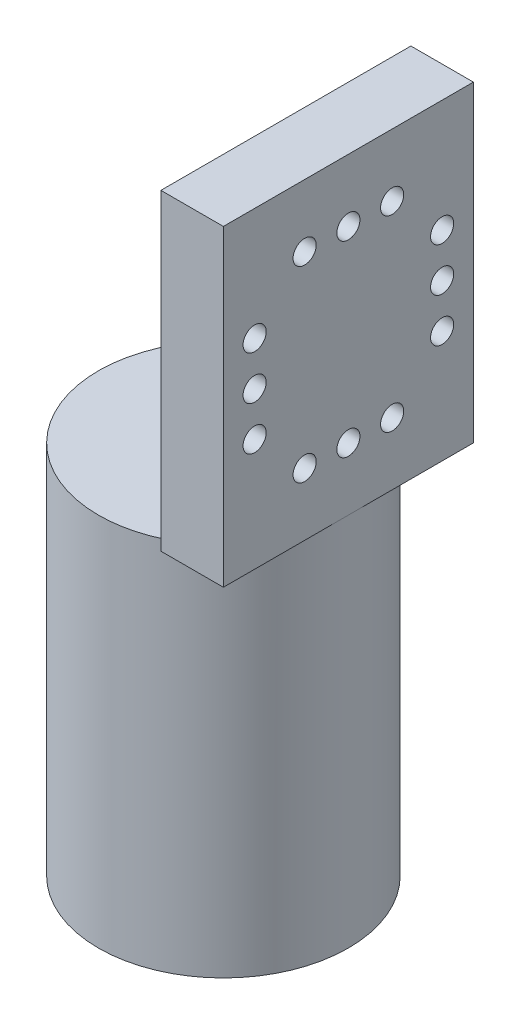
ISO-10303-21;
HEADER;
FILE_DESCRIPTION(('STEP AP214'),'2;1');
FILE_NAME('part.step','',(''),(''),'','','');
FILE_SCHEMA(('AUTOMOTIVE_DESIGN { 1 0 10303 214 1 1 1 1 }'));
ENDSEC;
DATA;
#1=APPLICATION_CONTEXT('core data for automotive mechanical design processes');
#2=APPLICATION_PROTOCOL_DEFINITION('international standard','automotive_design',2000,#1);
#3=PRODUCT_CONTEXT('',#1,'mechanical');
#4=PRODUCT('Part','Part','',(#3));
#5=PRODUCT_RELATED_PRODUCT_CATEGORY('part','',(#4));
#6=PRODUCT_DEFINITION_FORMATION('','',#4);
#7=PRODUCT_DEFINITION_CONTEXT('part definition',#1,'design');
#8=PRODUCT_DEFINITION('design','',#6,#7);
#9=PRODUCT_DEFINITION_SHAPE('','',#8);
#10=(LENGTH_UNIT() NAMED_UNIT(*) SI_UNIT(.MILLI.,.METRE.));
#11=(NAMED_UNIT(*) PLANE_ANGLE_UNIT() SI_UNIT($,.RADIAN.));
#12=(NAMED_UNIT(*) SI_UNIT($,.STERADIAN.) SOLID_ANGLE_UNIT());
#13=UNCERTAINTY_MEASURE_WITH_UNIT(LENGTH_MEASURE(1.E-05),#10,'distance_accuracy_value','');
#14=(GEOMETRIC_REPRESENTATION_CONTEXT(3) GLOBAL_UNCERTAINTY_ASSIGNED_CONTEXT((#13)) GLOBAL_UNIT_ASSIGNED_CONTEXT((#10,
#11,#12)) REPRESENTATION_CONTEXT('',''));
#15=CARTESIAN_POINT('',(0.,0.,0.));
#16=DIRECTION('',(0.,0.,1.));
#17=DIRECTION('',(1.,0.,0.));
#18=AXIS2_PLACEMENT_3D('',#15,#16,#17);
#19=CARTESIAN_POINT('',(0.,0.,0.));
#20=DIRECTION('',(0.,1.,0.));
#21=DIRECTION('',(0.,0.,1.));
#22=AXIS2_PLACEMENT_3D('',#19,#20,#21);
#23=PLANE('',#22);
#24=CARTESIAN_POINT('',(0.,0.,0.));
#25=DIRECTION('',(0.,1.,0.));
#26=DIRECTION('',(0.,0.,1.));
#27=AXIS2_PLACEMENT_3D('',#24,#25,#26);
#28=CIRCLE('',#27,10.);
#29=CARTESIAN_POINT('',(5.,0.,-8.66025403784439));
#30=VERTEX_POINT('',#29);
#31=CARTESIAN_POINT('',(5.,0.,8.66025403784439));
#32=VERTEX_POINT('',#31);
#33=EDGE_CURVE('E95',#30,#32,#28,.T.);
#34=ORIENTED_EDGE('',*,*,#33,.T.);
#35=DIRECTION('',(0.,0.,-1.));
#36=VECTOR('',#35,1.);
#37=CARTESIAN_POINT('',(5.,0.,0.));
#38=LINE('',#37,#36);
#39=EDGE_CURVE('E11',#32,#30,#38,.T.);
#40=ORIENTED_EDGE('',*,*,#39,.T.);
#41=EDGE_LOOP('',(#34,#40));
#42=FACE_BOUND('',#41,.T.);
#43=ADVANCED_FACE('F33',(#42),#23,.T.);
#44=CARTESIAN_POINT('',(0.,-30.,0.));
#45=DIRECTION('',(0.,1.,0.));
#46=DIRECTION('',(0.,0.,1.));
#47=AXIS2_PLACEMENT_3D('',#44,#45,#46);
#48=CYLINDRICAL_SURFACE('',#47,10.);
#49=CARTESIAN_POINT('',(0.,-30.,0.));
#50=DIRECTION('',(0.,1.,0.));
#51=DIRECTION('',(0.,0.,1.));
#52=AXIS2_PLACEMENT_3D('',#49,#50,#51);
#53=CIRCLE('',#52,10.);
#54=CARTESIAN_POINT('',(0.,-30.,10.));
#55=VERTEX_POINT('',#54);
#56=EDGE_CURVE('E42',#55,#55,#53,.T.);
#57=ORIENTED_EDGE('',*,*,#56,.T.);
#58=EDGE_LOOP('',(#57));
#59=FACE_BOUND('',#58,.T.);
#60=CARTESIAN_POINT('',(10.,0.,0.));
#61=VERTEX_POINT('',#60);
#62=EDGE_CURVE('E37',#32,#61,#28,.T.);
#63=ORIENTED_EDGE('',*,*,#62,.F.);
#64=ORIENTED_EDGE('',*,*,#33,.F.);
#65=EDGE_CURVE('E130',#61,#30,#28,.T.);
#66=ORIENTED_EDGE('',*,*,#65,.F.);
#67=EDGE_LOOP('',(#63,#64,#66));
#68=FACE_BOUND('',#67,.T.);
#69=ADVANCED_FACE('F35',(#59,#68),#48,.T.);
#70=CARTESIAN_POINT('',(0.,-30.,0.));
#71=DIRECTION('',(0.,1.,0.));
#72=DIRECTION('',(0.,0.,1.));
#73=AXIS2_PLACEMENT_3D('',#70,#71,#72);
#74=PLANE('',#73);
#75=CARTESIAN_POINT('',(0.,-30.,0.));
#76=DIRECTION('',(0.,-1.,0.));
#77=DIRECTION('',(0.,0.,-1.));
#78=AXIS2_PLACEMENT_3D('',#75,#76,#77);
#79=CIRCLE('',#78,5.05);
#80=CARTESIAN_POINT('',(0.,-30.,-5.05));
#81=VERTEX_POINT('',#80);
#82=EDGE_CURVE('E236',#81,#81,#79,.T.);
#83=ORIENTED_EDGE('',*,*,#82,.F.);
#84=EDGE_LOOP('',(#83));
#85=FACE_BOUND('',#84,.T.);
#86=ORIENTED_EDGE('',*,*,#56,.F.);
#87=EDGE_LOOP('',(#86));
#88=FACE_BOUND('',#87,.T.);
#89=ADVANCED_FACE('F144',(#85,#88),#74,.F.);
#90=CARTESIAN_POINT('',(0.,0.,0.));
#91=DIRECTION('',(0.,1.,0.));
#92=DIRECTION('',(0.,0.,1.));
#93=AXIS2_PLACEMENT_3D('',#90,#91,#92);
#94=PLANE('',#93);
#95=CARTESIAN_POINT('',(5.,0.,10.));
#96=VERTEX_POINT('',#95);
#97=EDGE_CURVE('E44',#96,#32,#38,.T.);
#98=ORIENTED_EDGE('',*,*,#97,.T.);
#99=ORIENTED_EDGE('',*,*,#62,.T.);
#100=DIRECTION('',(0.,0.,-1.));
#101=VECTOR('',#100,1.);
#102=CARTESIAN_POINT('',(10.,0.,0.));
#103=LINE('',#102,#101);
#104=CARTESIAN_POINT('',(10.,0.,10.));
#105=VERTEX_POINT('',#104);
#106=EDGE_CURVE('E118',#105,#61,#103,.T.);
#107=ORIENTED_EDGE('',*,*,#106,.F.);
#108=DIRECTION('',(-1.,0.,0.));
#109=VECTOR('',#108,1.);
#110=CARTESIAN_POINT('',(0.,0.,10.));
#111=LINE('',#110,#109);
#112=EDGE_CURVE('E115',#105,#96,#111,.T.);
#113=ORIENTED_EDGE('',*,*,#112,.T.);
#114=EDGE_LOOP('',(#98,#99,#107,#113));
#115=FACE_BOUND('',#114,.T.);
#116=ADVANCED_FACE('F142',(#115),#94,.F.);
#117=CARTESIAN_POINT('',(10.,0.,-10.));
#118=VERTEX_POINT('',#117);
#119=EDGE_CURVE('E117',#61,#118,#103,.T.);
#120=ORIENTED_EDGE('',*,*,#119,.F.);
#121=ORIENTED_EDGE('',*,*,#65,.T.);
#122=CARTESIAN_POINT('',(5.,0.,-10.));
#123=VERTEX_POINT('',#122);
#124=EDGE_CURVE('E45',#30,#123,#38,.T.);
#125=ORIENTED_EDGE('',*,*,#124,.T.);
#126=DIRECTION('',(1.,0.,0.));
#127=VECTOR('',#126,1.);
#128=CARTESIAN_POINT('',(0.,0.,-10.));
#129=LINE('',#128,#127);
#130=EDGE_CURVE('E104',#123,#118,#129,.T.);
#131=ORIENTED_EDGE('',*,*,#130,.T.);
#132=EDGE_LOOP('',(#120,#121,#125,#131));
#133=FACE_BOUND('',#132,.T.);
#134=ADVANCED_FACE('F137',(#133),#94,.F.);
#135=CARTESIAN_POINT('',(5.,25.,0.));
#136=DIRECTION('',(-1.,0.,0.));
#137=DIRECTION('',(0.,0.,1.));
#138=AXIS2_PLACEMENT_3D('',#135,#136,#137);
#139=PLANE('',#138);
#140=CARTESIAN_POINT('',(5.,20.,-3.5));
#141=DIRECTION('',(-1.,0.,0.));
#142=DIRECTION('',(0.,0.,1.));
#143=AXIS2_PLACEMENT_3D('',#140,#141,#142);
#144=CIRCLE('',#143,0.924999999999997);
#145=CARTESIAN_POINT('',(5.,20.,-2.575));
#146=VERTEX_POINT('',#145);
#147=EDGE_CURVE('E308',#146,#146,#144,.T.);
#148=ORIENTED_EDGE('',*,*,#147,.F.);
#149=EDGE_LOOP('',(#148));
#150=FACE_BOUND('',#149,.T.);
#151=CARTESIAN_POINT('',(5.,12.5,7.5));
#152=DIRECTION('',(-1.,0.,0.));
#153=DIRECTION('',(0.,0.,1.));
#154=AXIS2_PLACEMENT_3D('',#151,#152,#153);
#155=CIRCLE('',#154,0.925000000000002);
#156=CARTESIAN_POINT('',(5.,12.5,8.425));
#157=VERTEX_POINT('',#156);
#158=EDGE_CURVE('E306',#157,#157,#155,.T.);
#159=ORIENTED_EDGE('',*,*,#158,.F.);
#160=EDGE_LOOP('',(#159));
#161=FACE_BOUND('',#160,.T.);
#162=CARTESIAN_POINT('',(5.,12.5,-7.5));
#163=DIRECTION('',(-1.,0.,0.));
#164=DIRECTION('',(0.,0.,1.));
#165=AXIS2_PLACEMENT_3D('',#162,#163,#164);
#166=CIRCLE('',#165,0.925000000000001);
#167=CARTESIAN_POINT('',(5.,12.5,-6.575));
#168=VERTEX_POINT('',#167);
#169=EDGE_CURVE('E303',#168,#168,#166,.T.);
#170=ORIENTED_EDGE('',*,*,#169,.F.);
#171=EDGE_LOOP('',(#170));
#172=FACE_BOUND('',#171,.T.);
#173=CARTESIAN_POINT('',(5.,9.,7.5));
#174=DIRECTION('',(-1.,0.,0.));
#175=DIRECTION('',(0.,0.,1.));
#176=AXIS2_PLACEMENT_3D('',#173,#174,#175);
#177=CIRCLE('',#176,0.925000000000001);
#178=CARTESIAN_POINT('',(5.,9.,8.425));
#179=VERTEX_POINT('',#178);
#180=EDGE_CURVE('E300',#179,#179,#177,.T.);
#181=ORIENTED_EDGE('',*,*,#180,.F.);
#182=EDGE_LOOP('',(#181));
#183=FACE_BOUND('',#182,.T.);
#184=CARTESIAN_POINT('',(5.,20.,3.5));
#185=DIRECTION('',(-1.,0.,0.));
#186=DIRECTION('',(0.,0.,1.));
#187=AXIS2_PLACEMENT_3D('',#184,#185,#186);
#188=CIRCLE('',#187,0.925);
#189=CARTESIAN_POINT('',(5.,20.,4.425));
#190=VERTEX_POINT('',#189);
#191=EDGE_CURVE('E297',#190,#190,#188,.T.);
#192=ORIENTED_EDGE('',*,*,#191,.F.);
#193=EDGE_LOOP('',(#192));
#194=FACE_BOUND('',#193,.T.);
#195=CARTESIAN_POINT('',(5.,20.,0.));
#196=DIRECTION('',(-1.,0.,0.));
#197=DIRECTION('',(0.,0.,1.));
#198=AXIS2_PLACEMENT_3D('',#195,#196,#197);
#199=CIRCLE('',#198,0.925000000000007);
#200=CARTESIAN_POINT('',(5.,20.,0.92500000000001));
#201=VERTEX_POINT('',#200);
#202=EDGE_CURVE('E294',#201,#201,#199,.T.);
#203=ORIENTED_EDGE('',*,*,#202,.F.);
#204=EDGE_LOOP('',(#203));
#205=FACE_BOUND('',#204,.T.);
#206=CARTESIAN_POINT('',(5.,5.,3.5));
#207=DIRECTION('',(-1.,0.,0.));
#208=DIRECTION('',(0.,0.,1.));
#209=AXIS2_PLACEMENT_3D('',#206,#207,#208);
#210=CIRCLE('',#209,0.925000000000001);
#211=CARTESIAN_POINT('',(5.,5.,4.425));
#212=VERTEX_POINT('',#211);
#213=EDGE_CURVE('E291',#212,#212,#210,.T.);
#214=ORIENTED_EDGE('',*,*,#213,.F.);
#215=EDGE_LOOP('',(#214));
#216=FACE_BOUND('',#215,.T.);
#217=CARTESIAN_POINT('',(5.,5.,-3.5));
#218=DIRECTION('',(-1.,0.,0.));
#219=DIRECTION('',(0.,0.,1.));
#220=AXIS2_PLACEMENT_3D('',#217,#218,#219);
#221=CIRCLE('',#220,0.925000000000001);
#222=CARTESIAN_POINT('',(5.,5.,-2.575));
#223=VERTEX_POINT('',#222);
#224=EDGE_CURVE('E288',#223,#223,#221,.T.);
#225=ORIENTED_EDGE('',*,*,#224,.F.);
#226=EDGE_LOOP('',(#225));
#227=FACE_BOUND('',#226,.T.);
#228=CARTESIAN_POINT('',(5.,16.,-7.5));
#229=DIRECTION('',(-1.,0.,0.));
#230=DIRECTION('',(0.,0.,1.));
#231=AXIS2_PLACEMENT_3D('',#228,#229,#230);
#232=CIRCLE('',#231,0.924999999999999);
#233=CARTESIAN_POINT('',(5.,16.,-6.575));
#234=VERTEX_POINT('',#233);
#235=EDGE_CURVE('E285',#234,#234,#232,.T.);
#236=ORIENTED_EDGE('',*,*,#235,.F.);
#237=EDGE_LOOP('',(#236));
#238=FACE_BOUND('',#237,.T.);
#239=CARTESIAN_POINT('',(5.,9.,-7.5));
#240=DIRECTION('',(-1.,0.,0.));
#241=DIRECTION('',(0.,0.,1.));
#242=AXIS2_PLACEMENT_3D('',#239,#240,#241);
#243=CIRCLE('',#242,0.925000000000002);
#244=CARTESIAN_POINT('',(5.,9.,-6.575));
#245=VERTEX_POINT('',#244);
#246=EDGE_CURVE('E282',#245,#245,#243,.T.);
#247=ORIENTED_EDGE('',*,*,#246,.F.);
#248=EDGE_LOOP('',(#247));
#249=FACE_BOUND('',#248,.T.);
#250=CARTESIAN_POINT('',(5.,16.,7.5));
#251=DIRECTION('',(-1.,0.,0.));
#252=DIRECTION('',(0.,0.,1.));
#253=AXIS2_PLACEMENT_3D('',#250,#251,#252);
#254=CIRCLE('',#253,0.924999999999999);
#255=CARTESIAN_POINT('',(5.,16.,8.425));
#256=VERTEX_POINT('',#255);
#257=EDGE_CURVE('E279',#256,#256,#254,.T.);
#258=ORIENTED_EDGE('',*,*,#257,.F.);
#259=EDGE_LOOP('',(#258));
#260=FACE_BOUND('',#259,.T.);
#261=CARTESIAN_POINT('',(5.,5.,0.));
#262=DIRECTION('',(-1.,0.,0.));
#263=DIRECTION('',(0.,0.,1.));
#264=AXIS2_PLACEMENT_3D('',#261,#262,#263);
#265=CIRCLE('',#264,0.925);
#266=CARTESIAN_POINT('',(5.,5.,0.925));
#267=VERTEX_POINT('',#266);
#268=EDGE_CURVE('E276',#267,#267,#265,.T.);
#269=ORIENTED_EDGE('',*,*,#268,.F.);
#270=EDGE_LOOP('',(#269));
#271=FACE_BOUND('',#270,.T.);
#272=ORIENTED_EDGE('',*,*,#97,.F.);
#273=DIRECTION('',(0.,-1.,0.));
#274=VECTOR('',#273,1.);
#275=CARTESIAN_POINT('',(5.,25.,10.));
#276=LINE('',#275,#274);
#277=CARTESIAN_POINT('',(5.,25.,10.));
#278=VERTEX_POINT('',#277);
#279=EDGE_CURVE('E86',#278,#96,#276,.T.);
#280=ORIENTED_EDGE('',*,*,#279,.F.);
#281=DIRECTION('',(0.,0.,-1.));
#282=VECTOR('',#281,1.);
#283=CARTESIAN_POINT('',(5.,25.,0.));
#284=LINE('',#283,#282);
#285=CARTESIAN_POINT('',(5.,25.,-10.));
#286=VERTEX_POINT('',#285);
#287=EDGE_CURVE('E89',#278,#286,#284,.T.);
#288=ORIENTED_EDGE('',*,*,#287,.T.);
#289=DIRECTION('',(0.,-1.,0.));
#290=VECTOR('',#289,1.);
#291=CARTESIAN_POINT('',(5.,25.,-10.));
#292=LINE('',#291,#290);
#293=EDGE_CURVE('E113',#286,#123,#292,.T.);
#294=ORIENTED_EDGE('',*,*,#293,.T.);
#295=ORIENTED_EDGE('',*,*,#124,.F.);
#296=ORIENTED_EDGE('',*,*,#39,.F.);
#297=EDGE_LOOP('',(#272,#280,#288,#294,#295,#296));
#298=FACE_BOUND('',#297,.T.);
#299=ADVANCED_FACE('F88',(#150,#161,#172,#183,#194,#205,#216,#227,#238,#249,#260,#271,#298),
#139,.T.);
#300=CARTESIAN_POINT('',(0.,25.,10.));
#301=DIRECTION('',(0.,0.,1.));
#302=DIRECTION('',(1.,0.,0.));
#303=AXIS2_PLACEMENT_3D('',#300,#301,#302);
#304=PLANE('',#303);
#305=ORIENTED_EDGE('',*,*,#112,.F.);
#306=DIRECTION('',(0.,-1.,0.));
#307=VECTOR('',#306,1.);
#308=CARTESIAN_POINT('',(10.,25.,10.));
#309=LINE('',#308,#307);
#310=CARTESIAN_POINT('',(10.,25.,10.));
#311=VERTEX_POINT('',#310);
#312=EDGE_CURVE('E96',#311,#105,#309,.T.);
#313=ORIENTED_EDGE('',*,*,#312,.F.);
#314=DIRECTION('',(-1.,0.,0.));
#315=VECTOR('',#314,1.);
#316=CARTESIAN_POINT('',(0.,25.,10.));
#317=LINE('',#316,#315);
#318=EDGE_CURVE('E101',#311,#278,#317,.T.);
#319=ORIENTED_EDGE('',*,*,#318,.T.);
#320=ORIENTED_EDGE('',*,*,#279,.T.);
#321=EDGE_LOOP('',(#305,#313,#319,#320));
#322=FACE_BOUND('',#321,.T.);
#323=ADVANCED_FACE('F106',(#322),#304,.T.);
#324=CARTESIAN_POINT('',(10.,25.,0.));
#325=DIRECTION('',(-1.,0.,0.));
#326=DIRECTION('',(0.,0.,1.));
#327=AXIS2_PLACEMENT_3D('',#324,#325,#326);
#328=PLANE('',#327);
#329=CARTESIAN_POINT('',(10.,20.,-3.5));
#330=DIRECTION('',(1.,0.,0.));
#331=DIRECTION('',(0.,0.,-1.));
#332=AXIS2_PLACEMENT_3D('',#329,#330,#331);
#333=CIRCLE('',#332,0.924999999999997);
#334=CARTESIAN_POINT('',(10.,20.,-4.425));
#335=VERTEX_POINT('',#334);
#336=EDGE_CURVE('E256',#335,#335,#333,.T.);
#337=ORIENTED_EDGE('',*,*,#336,.F.);
#338=EDGE_LOOP('',(#337));
#339=FACE_BOUND('',#338,.T.);
#340=CARTESIAN_POINT('',(10.,12.5,7.5));
#341=DIRECTION('',(1.,0.,0.));
#342=DIRECTION('',(0.,0.,-1.));
#343=AXIS2_PLACEMENT_3D('',#340,#341,#342);
#344=CIRCLE('',#343,0.925000000000002);
#345=CARTESIAN_POINT('',(10.,12.5,6.575));
#346=VERTEX_POINT('',#345);
#347=EDGE_CURVE('E253',#346,#346,#344,.T.);
#348=ORIENTED_EDGE('',*,*,#347,.F.);
#349=EDGE_LOOP('',(#348));
#350=FACE_BOUND('',#349,.T.);
#351=CARTESIAN_POINT('',(10.,12.5,-7.5));
#352=DIRECTION('',(1.,0.,0.));
#353=DIRECTION('',(0.,0.,-1.));
#354=AXIS2_PLACEMENT_3D('',#351,#352,#353);
#355=CIRCLE('',#354,0.925000000000001);
#356=CARTESIAN_POINT('',(10.,12.5,-8.425));
#357=VERTEX_POINT('',#356);
#358=EDGE_CURVE('E250',#357,#357,#355,.T.);
#359=ORIENTED_EDGE('',*,*,#358,.F.);
#360=EDGE_LOOP('',(#359));
#361=FACE_BOUND('',#360,.T.);
#362=CARTESIAN_POINT('',(10.,9.,7.5));
#363=DIRECTION('',(1.,0.,0.));
#364=DIRECTION('',(0.,0.,-1.));
#365=AXIS2_PLACEMENT_3D('',#362,#363,#364);
#366=CIRCLE('',#365,0.925000000000001);
#367=CARTESIAN_POINT('',(10.,9.,6.575));
#368=VERTEX_POINT('',#367);
#369=EDGE_CURVE('E247',#368,#368,#366,.T.);
#370=ORIENTED_EDGE('',*,*,#369,.F.);
#371=EDGE_LOOP('',(#370));
#372=FACE_BOUND('',#371,.T.);
#373=CARTESIAN_POINT('',(10.,20.,3.5));
#374=DIRECTION('',(1.,0.,0.));
#375=DIRECTION('',(0.,0.,-1.));
#376=AXIS2_PLACEMENT_3D('',#373,#374,#375);
#377=CIRCLE('',#376,0.925);
#378=CARTESIAN_POINT('',(10.,20.,2.575));
#379=VERTEX_POINT('',#378);
#380=EDGE_CURVE('E259',#379,#379,#377,.T.);
#381=ORIENTED_EDGE('',*,*,#380,.F.);
#382=EDGE_LOOP('',(#381));
#383=FACE_BOUND('',#382,.T.);
#384=CARTESIAN_POINT('',(10.,20.,0.));
#385=DIRECTION('',(1.,0.,0.));
#386=DIRECTION('',(0.,0.,-1.));
#387=AXIS2_PLACEMENT_3D('',#384,#385,#386);
#388=CIRCLE('',#387,0.925000000000007);
#389=CARTESIAN_POINT('',(10.,20.,-0.925000000000003));
#390=VERTEX_POINT('',#389);
#391=EDGE_CURVE('E269',#390,#390,#388,.T.);
#392=ORIENTED_EDGE('',*,*,#391,.F.);
#393=EDGE_LOOP('',(#392));
#394=FACE_BOUND('',#393,.T.);
#395=CARTESIAN_POINT('',(10.,5.,3.5));
#396=DIRECTION('',(1.,0.,0.));
#397=DIRECTION('',(0.,0.,-1.));
#398=AXIS2_PLACEMENT_3D('',#395,#396,#397);
#399=CIRCLE('',#398,0.925000000000001);
#400=CARTESIAN_POINT('',(10.,5.,2.575));
#401=VERTEX_POINT('',#400);
#402=EDGE_CURVE('E266',#401,#401,#399,.T.);
#403=ORIENTED_EDGE('',*,*,#402,.F.);
#404=EDGE_LOOP('',(#403));
#405=FACE_BOUND('',#404,.T.);
#406=CARTESIAN_POINT('',(10.,5.,-3.5));
#407=DIRECTION('',(1.,0.,0.));
#408=DIRECTION('',(0.,0.,-1.));
#409=AXIS2_PLACEMENT_3D('',#406,#407,#408);
#410=CIRCLE('',#409,0.925000000000001);
#411=CARTESIAN_POINT('',(10.,5.,-4.425));
#412=VERTEX_POINT('',#411);
#413=EDGE_CURVE('E262',#412,#412,#410,.T.);
#414=ORIENTED_EDGE('',*,*,#413,.F.);
#415=EDGE_LOOP('',(#414));
#416=FACE_BOUND('',#415,.T.);
#417=CARTESIAN_POINT('',(10.,16.,-7.5));
#418=DIRECTION('',(1.,0.,0.));
#419=DIRECTION('',(0.,0.,-1.));
#420=AXIS2_PLACEMENT_3D('',#417,#418,#419);
#421=CIRCLE('',#420,0.924999999999999);
#422=CARTESIAN_POINT('',(10.,16.,-8.425));
#423=VERTEX_POINT('',#422);
#424=EDGE_CURVE('E235',#423,#423,#421,.T.);
#425=ORIENTED_EDGE('',*,*,#424,.F.);
#426=EDGE_LOOP('',(#425));
#427=FACE_BOUND('',#426,.T.);
#428=CARTESIAN_POINT('',(10.,9.,-7.5));
#429=DIRECTION('',(1.,0.,0.));
#430=DIRECTION('',(0.,0.,-1.));
#431=AXIS2_PLACEMENT_3D('',#428,#429,#430);
#432=CIRCLE('',#431,0.925000000000002);
#433=CARTESIAN_POINT('',(10.,9.,-8.425));
#434=VERTEX_POINT('',#433);
#435=EDGE_CURVE('E239',#434,#434,#432,.T.);
#436=ORIENTED_EDGE('',*,*,#435,.F.);
#437=EDGE_LOOP('',(#436));
#438=FACE_BOUND('',#437,.T.);
#439=CARTESIAN_POINT('',(10.,16.,7.5));
#440=DIRECTION('',(1.,0.,0.));
#441=DIRECTION('',(0.,0.,-1.));
#442=AXIS2_PLACEMENT_3D('',#439,#440,#441);
#443=CIRCLE('',#442,0.924999999999999);
#444=CARTESIAN_POINT('',(10.,16.,6.575));
#445=VERTEX_POINT('',#444);
#446=EDGE_CURVE('E244',#445,#445,#443,.T.);
#447=ORIENTED_EDGE('',*,*,#446,.F.);
#448=EDGE_LOOP('',(#447));
#449=FACE_BOUND('',#448,.T.);
#450=CARTESIAN_POINT('',(10.,5.,0.));
#451=DIRECTION('',(1.,0.,0.));
#452=DIRECTION('',(0.,0.,-1.));
#453=AXIS2_PLACEMENT_3D('',#450,#451,#452);
#454=CIRCLE('',#453,0.925);
#455=CARTESIAN_POINT('',(10.,5.,-0.925));
#456=VERTEX_POINT('',#455);
#457=EDGE_CURVE('E265',#456,#456,#454,.T.);
#458=ORIENTED_EDGE('',*,*,#457,.F.);
#459=EDGE_LOOP('',(#458));
#460=FACE_BOUND('',#459,.T.);
#461=ORIENTED_EDGE('',*,*,#106,.T.);
#462=ORIENTED_EDGE('',*,*,#119,.T.);
#463=DIRECTION('',(0.,-1.,0.));
#464=VECTOR('',#463,1.);
#465=CARTESIAN_POINT('',(10.,25.,-10.));
#466=LINE('',#465,#464);
#467=CARTESIAN_POINT('',(10.,25.,-10.));
#468=VERTEX_POINT('',#467);
#469=EDGE_CURVE('E124',#468,#118,#466,.T.);
#470=ORIENTED_EDGE('',*,*,#469,.F.);
#471=DIRECTION('',(0.,0.,-1.));
#472=VECTOR('',#471,1.);
#473=CARTESIAN_POINT('',(10.,25.,0.));
#474=LINE('',#473,#472);
#475=EDGE_CURVE('E108',#311,#468,#474,.T.);
#476=ORIENTED_EDGE('',*,*,#475,.F.);
#477=ORIENTED_EDGE('',*,*,#312,.T.);
#478=EDGE_LOOP('',(#461,#462,#470,#476,#477));
#479=FACE_BOUND('',#478,.T.);
#480=ADVANCED_FACE('F141',(#339,#350,#361,#372,#383,#394,#405,#416,#427,#438,#449,#460,#479),
#328,.F.);
#481=CARTESIAN_POINT('',(0.,25.,-10.));
#482=DIRECTION('',(0.,0.,-1.));
#483=DIRECTION('',(-1.,0.,0.));
#484=AXIS2_PLACEMENT_3D('',#481,#482,#483);
#485=PLANE('',#484);
#486=ORIENTED_EDGE('',*,*,#130,.F.);
#487=ORIENTED_EDGE('',*,*,#293,.F.);
#488=DIRECTION('',(1.,0.,0.));
#489=VECTOR('',#488,1.);
#490=CARTESIAN_POINT('',(0.,25.,-10.));
#491=LINE('',#490,#489);
#492=EDGE_CURVE('E103',#286,#468,#491,.T.);
#493=ORIENTED_EDGE('',*,*,#492,.T.);
#494=ORIENTED_EDGE('',*,*,#469,.T.);
#495=EDGE_LOOP('',(#486,#487,#493,#494));
#496=FACE_BOUND('',#495,.T.);
#497=ADVANCED_FACE('F165',(#496),#485,.T.);
#498=CARTESIAN_POINT('',(0.,25.,0.));
#499=DIRECTION('',(0.,1.,0.));
#500=DIRECTION('',(0.,0.,1.));
#501=AXIS2_PLACEMENT_3D('',#498,#499,#500);
#502=PLANE('',#501);
#503=ORIENTED_EDGE('',*,*,#287,.F.);
#504=ORIENTED_EDGE('',*,*,#318,.F.);
#505=ORIENTED_EDGE('',*,*,#475,.T.);
#506=ORIENTED_EDGE('',*,*,#492,.F.);
#507=EDGE_LOOP('',(#503,#504,#505,#506));
#508=FACE_BOUND('',#507,.T.);
#509=ADVANCED_FACE('F100',(#508),#502,.T.);
#510=CARTESIAN_POINT('',(-10.,5.,0.));
#511=DIRECTION('',(1.,0.,0.));
#512=DIRECTION('',(0.,0.,-1.));
#513=AXIS2_PLACEMENT_3D('',#510,#511,#512);
#514=CYLINDRICAL_SURFACE('',#513,0.925);
#515=ORIENTED_EDGE('',*,*,#268,.T.);
#516=EDGE_LOOP('',(#515));
#517=FACE_BOUND('',#516,.T.);
#518=ORIENTED_EDGE('',*,*,#457,.T.);
#519=EDGE_LOOP('',(#518));
#520=FACE_BOUND('',#519,.T.);
#521=ADVANCED_FACE('F172',(#517,#520),#514,.F.);
#522=CARTESIAN_POINT('',(-10.,16.,7.5));
#523=DIRECTION('',(1.,0.,0.));
#524=DIRECTION('',(0.,0.,-1.));
#525=AXIS2_PLACEMENT_3D('',#522,#523,#524);
#526=CYLINDRICAL_SURFACE('',#525,0.924999999999999);
#527=ORIENTED_EDGE('',*,*,#257,.T.);
#528=EDGE_LOOP('',(#527));
#529=FACE_BOUND('',#528,.T.);
#530=ORIENTED_EDGE('',*,*,#446,.T.);
#531=EDGE_LOOP('',(#530));
#532=FACE_BOUND('',#531,.T.);
#533=ADVANCED_FACE('F176',(#529,#532),#526,.F.);
#534=CARTESIAN_POINT('',(-10.,9.,-7.5));
#535=DIRECTION('',(1.,0.,0.));
#536=DIRECTION('',(0.,0.,-1.));
#537=AXIS2_PLACEMENT_3D('',#534,#535,#536);
#538=CYLINDRICAL_SURFACE('',#537,0.925000000000002);
#539=ORIENTED_EDGE('',*,*,#246,.T.);
#540=EDGE_LOOP('',(#539));
#541=FACE_BOUND('',#540,.T.);
#542=ORIENTED_EDGE('',*,*,#435,.T.);
#543=EDGE_LOOP('',(#542));
#544=FACE_BOUND('',#543,.T.);
#545=ADVANCED_FACE('F214',(#541,#544),#538,.F.);
#546=CARTESIAN_POINT('',(-10.,16.,-7.5));
#547=DIRECTION('',(1.,0.,0.));
#548=DIRECTION('',(0.,0.,-1.));
#549=AXIS2_PLACEMENT_3D('',#546,#547,#548);
#550=CYLINDRICAL_SURFACE('',#549,0.924999999999999);
#551=ORIENTED_EDGE('',*,*,#235,.T.);
#552=EDGE_LOOP('',(#551));
#553=FACE_BOUND('',#552,.T.);
#554=ORIENTED_EDGE('',*,*,#424,.T.);
#555=EDGE_LOOP('',(#554));
#556=FACE_BOUND('',#555,.T.);
#557=ADVANCED_FACE('F196',(#553,#556),#550,.F.);
#558=CARTESIAN_POINT('',(-10.,5.,-3.5));
#559=DIRECTION('',(1.,0.,0.));
#560=DIRECTION('',(0.,0.,-1.));
#561=AXIS2_PLACEMENT_3D('',#558,#559,#560);
#562=CYLINDRICAL_SURFACE('',#561,0.925000000000001);
#563=ORIENTED_EDGE('',*,*,#224,.T.);
#564=EDGE_LOOP('',(#563));
#565=FACE_BOUND('',#564,.T.);
#566=ORIENTED_EDGE('',*,*,#413,.T.);
#567=EDGE_LOOP('',(#566));
#568=FACE_BOUND('',#567,.T.);
#569=ADVANCED_FACE('F192',(#565,#568),#562,.F.);
#570=CARTESIAN_POINT('',(-10.,5.,3.5));
#571=DIRECTION('',(1.,0.,0.));
#572=DIRECTION('',(0.,0.,-1.));
#573=AXIS2_PLACEMENT_3D('',#570,#571,#572);
#574=CYLINDRICAL_SURFACE('',#573,0.925000000000001);
#575=ORIENTED_EDGE('',*,*,#213,.T.);
#576=EDGE_LOOP('',(#575));
#577=FACE_BOUND('',#576,.T.);
#578=ORIENTED_EDGE('',*,*,#402,.T.);
#579=EDGE_LOOP('',(#578));
#580=FACE_BOUND('',#579,.T.);
#581=ADVANCED_FACE('F188',(#577,#580),#574,.F.);
#582=CARTESIAN_POINT('',(-10.,20.,0.));
#583=DIRECTION('',(1.,0.,0.));
#584=DIRECTION('',(0.,0.,-1.));
#585=AXIS2_PLACEMENT_3D('',#582,#583,#584);
#586=CYLINDRICAL_SURFACE('',#585,0.925000000000007);
#587=ORIENTED_EDGE('',*,*,#202,.T.);
#588=EDGE_LOOP('',(#587));
#589=FACE_BOUND('',#588,.T.);
#590=ORIENTED_EDGE('',*,*,#391,.T.);
#591=EDGE_LOOP('',(#590));
#592=FACE_BOUND('',#591,.T.);
#593=ADVANCED_FACE('F184',(#589,#592),#586,.F.);
#594=CARTESIAN_POINT('',(-10.,20.,3.5));
#595=DIRECTION('',(1.,0.,0.));
#596=DIRECTION('',(0.,0.,-1.));
#597=AXIS2_PLACEMENT_3D('',#594,#595,#596);
#598=CYLINDRICAL_SURFACE('',#597,0.925);
#599=ORIENTED_EDGE('',*,*,#191,.T.);
#600=EDGE_LOOP('',(#599));
#601=FACE_BOUND('',#600,.T.);
#602=ORIENTED_EDGE('',*,*,#380,.T.);
#603=EDGE_LOOP('',(#602));
#604=FACE_BOUND('',#603,.T.);
#605=ADVANCED_FACE('F180',(#601,#604),#598,.F.);
#606=CARTESIAN_POINT('',(-10.,9.,7.5));
#607=DIRECTION('',(1.,0.,0.));
#608=DIRECTION('',(0.,0.,-1.));
#609=AXIS2_PLACEMENT_3D('',#606,#607,#608);
#610=CYLINDRICAL_SURFACE('',#609,0.925000000000001);
#611=ORIENTED_EDGE('',*,*,#180,.T.);
#612=EDGE_LOOP('',(#611));
#613=FACE_BOUND('',#612,.T.);
#614=ORIENTED_EDGE('',*,*,#369,.T.);
#615=EDGE_LOOP('',(#614));
#616=FACE_BOUND('',#615,.T.);
#617=ADVANCED_FACE('F183',(#613,#616),#610,.F.);
#618=CARTESIAN_POINT('',(-10.,12.5,-7.5));
#619=DIRECTION('',(1.,0.,0.));
#620=DIRECTION('',(0.,0.,-1.));
#621=AXIS2_PLACEMENT_3D('',#618,#619,#620);
#622=CYLINDRICAL_SURFACE('',#621,0.925000000000001);
#623=ORIENTED_EDGE('',*,*,#169,.T.);
#624=EDGE_LOOP('',(#623));
#625=FACE_BOUND('',#624,.T.);
#626=ORIENTED_EDGE('',*,*,#358,.T.);
#627=EDGE_LOOP('',(#626));
#628=FACE_BOUND('',#627,.T.);
#629=ADVANCED_FACE('F202',(#625,#628),#622,.F.);
#630=CARTESIAN_POINT('',(-10.,12.5,7.5));
#631=DIRECTION('',(1.,0.,0.));
#632=DIRECTION('',(0.,0.,-1.));
#633=AXIS2_PLACEMENT_3D('',#630,#631,#632);
#634=CYLINDRICAL_SURFACE('',#633,0.925000000000002);
#635=ORIENTED_EDGE('',*,*,#158,.T.);
#636=EDGE_LOOP('',(#635));
#637=FACE_BOUND('',#636,.T.);
#638=ORIENTED_EDGE('',*,*,#347,.T.);
#639=EDGE_LOOP('',(#638));
#640=FACE_BOUND('',#639,.T.);
#641=ADVANCED_FACE('F198',(#637,#640),#634,.F.);
#642=CARTESIAN_POINT('',(-10.,20.,-3.5));
#643=DIRECTION('',(1.,0.,0.));
#644=DIRECTION('',(0.,0.,-1.));
#645=AXIS2_PLACEMENT_3D('',#642,#643,#644);
#646=CYLINDRICAL_SURFACE('',#645,0.924999999999997);
#647=ORIENTED_EDGE('',*,*,#147,.T.);
#648=EDGE_LOOP('',(#647));
#649=FACE_BOUND('',#648,.T.);
#650=ORIENTED_EDGE('',*,*,#336,.T.);
#651=EDGE_LOOP('',(#650));
#652=FACE_BOUND('',#651,.T.);
#653=ADVANCED_FACE('F201',(#649,#652),#646,.F.);
#654=CARTESIAN_POINT('',(0.,-5.,0.));
#655=DIRECTION('',(0.,-1.,0.));
#656=DIRECTION('',(0.,0.,-1.));
#657=AXIS2_PLACEMENT_3D('',#654,#655,#656);
#658=CYLINDRICAL_SURFACE('',#657,5.05);
#659=CARTESIAN_POINT('',(0.,-5.,0.));
#660=DIRECTION('',(0.,-1.,0.));
#661=DIRECTION('',(0.,0.,-1.));
#662=AXIS2_PLACEMENT_3D('',#659,#660,#661);
#663=CIRCLE('',#662,5.05);
#664=CARTESIAN_POINT('',(0.,-5.,-5.05));
#665=VERTEX_POINT('',#664);
#666=EDGE_CURVE('E234',#665,#665,#663,.T.);
#667=ORIENTED_EDGE('',*,*,#666,.F.);
#668=EDGE_LOOP('',(#667));
#669=FACE_BOUND('',#668,.T.);
#670=ORIENTED_EDGE('',*,*,#82,.T.);
#671=EDGE_LOOP('',(#670));
#672=FACE_BOUND('',#671,.T.);
#673=ADVANCED_FACE('F206',(#669,#672),#658,.F.);
#674=CARTESIAN_POINT('',(0.,-5.,0.));
#675=DIRECTION('',(0.,-1.,0.));
#676=DIRECTION('',(0.,0.,-1.));
#677=AXIS2_PLACEMENT_3D('',#674,#675,#676);
#678=PLANE('',#677);
#679=ORIENTED_EDGE('',*,*,#666,.T.);
#680=EDGE_LOOP('',(#679));
#681=FACE_BOUND('',#680,.T.);
#682=ADVANCED_FACE('F226',(#681),#678,.T.);
#683=CLOSED_SHELL('',(#43,#69,#89,#116,#134,#299,#323,#480,#497,#509,#521,#533,#545,#557,#569,
#581,#593,#605,#617,#629,#641,#653,#673,#682));
#684=MANIFOLD_SOLID_BREP('B2',#683);
#685=ADVANCED_BREP_SHAPE_REPRESENTATION('',(#18,#684),#14);
#686=SHAPE_DEFINITION_REPRESENTATION(#9,#685);
ENDSEC;
END-ISO-10303-21;
